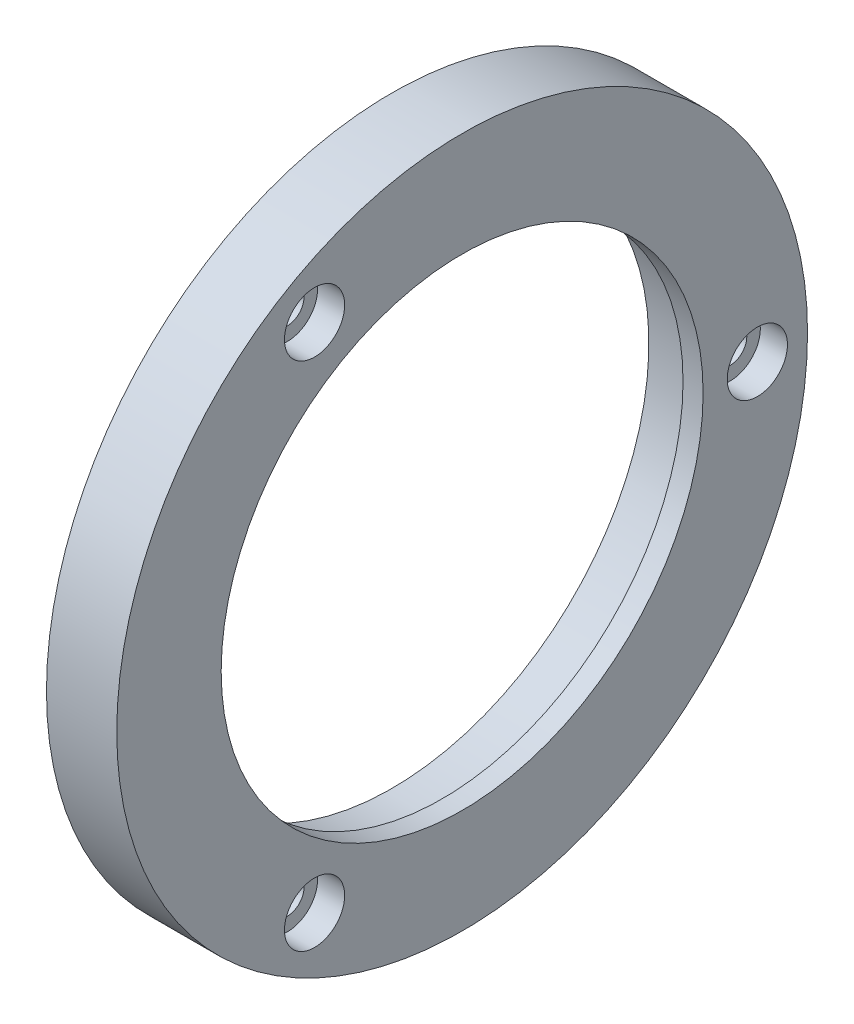
ISO-10303-21;
HEADER;
FILE_DESCRIPTION(('STEP AP214'),'2;1');
FILE_NAME('part.step','',(''),(''),'','','');
FILE_SCHEMA(('AUTOMOTIVE_DESIGN { 1 0 10303 214 1 1 1 1 }'));
ENDSEC;
DATA;
#1=APPLICATION_CONTEXT('core data for automotive mechanical design processes');
#2=APPLICATION_PROTOCOL_DEFINITION('international standard','automotive_design',2000,#1);
#3=PRODUCT_CONTEXT('',#1,'mechanical');
#4=PRODUCT('Part','Part','',(#3));
#5=PRODUCT_RELATED_PRODUCT_CATEGORY('part','',(#4));
#6=PRODUCT_DEFINITION_FORMATION('','',#4);
#7=PRODUCT_DEFINITION_CONTEXT('part definition',#1,'design');
#8=PRODUCT_DEFINITION('design','',#6,#7);
#9=PRODUCT_DEFINITION_SHAPE('','',#8);
#10=(LENGTH_UNIT() NAMED_UNIT(*) SI_UNIT(.MILLI.,.METRE.));
#11=(NAMED_UNIT(*) PLANE_ANGLE_UNIT() SI_UNIT($,.RADIAN.));
#12=(NAMED_UNIT(*) SI_UNIT($,.STERADIAN.) SOLID_ANGLE_UNIT());
#13=UNCERTAINTY_MEASURE_WITH_UNIT(LENGTH_MEASURE(1.E-05),#10,'distance_accuracy_value','');
#14=(GEOMETRIC_REPRESENTATION_CONTEXT(3) GLOBAL_UNCERTAINTY_ASSIGNED_CONTEXT((#13)) GLOBAL_UNIT_ASSIGNED_CONTEXT((#10,
#11,#12)) REPRESENTATION_CONTEXT('',''));
#15=CARTESIAN_POINT('',(0.,0.,0.));
#16=DIRECTION('',(0.,0.,1.));
#17=DIRECTION('',(1.,0.,0.));
#18=AXIS2_PLACEMENT_3D('',#15,#16,#17);
#19=CARTESIAN_POINT('',(176.7,-25.4611468712625,14.7));
#20=DIRECTION('',(-1.,0.,0.));
#21=DIRECTION('',(0.,0.,1.));
#22=AXIS2_PLACEMENT_3D('',#19,#20,#21);
#23=CYLINDRICAL_SURFACE('',#22,1.65);
#24=CARTESIAN_POINT('',(169.7,-25.4611468712625,14.7));
#25=DIRECTION('',(1.,0.,0.));
#26=DIRECTION('',(0.,0.,-1.));
#27=AXIS2_PLACEMENT_3D('',#24,#25,#26);
#28=CIRCLE('',#27,1.65);
#29=CARTESIAN_POINT('',(169.7,-25.4611468712625,13.05));
#30=VERTEX_POINT('',#29);
#31=EDGE_CURVE('E56',#30,#30,#28,.F.);
#32=ORIENTED_EDGE('',*,*,#31,.T.);
#33=EDGE_LOOP('',(#32));
#34=FACE_BOUND('',#33,.T.);
#35=CARTESIAN_POINT('',(174.,-25.4611468712625,14.7));
#36=DIRECTION('',(1.,0.,0.));
#37=DIRECTION('',(0.,0.,-1.));
#38=AXIS2_PLACEMENT_3D('',#35,#36,#37);
#39=CIRCLE('',#38,1.65);
#40=CARTESIAN_POINT('',(174.,-25.4611468712625,13.05));
#41=VERTEX_POINT('',#40);
#42=EDGE_CURVE('E35',#41,#41,#39,.T.);
#43=ORIENTED_EDGE('',*,*,#42,.T.);
#44=EDGE_LOOP('',(#43));
#45=FACE_BOUND('',#44,.T.);
#46=ADVANCED_FACE('F31',(#34,#45),#23,.F.);
#47=CARTESIAN_POINT('',(176.7,25.4611468712625,14.7));
#48=DIRECTION('',(-1.,0.,0.));
#49=DIRECTION('',(0.,0.,1.));
#50=AXIS2_PLACEMENT_3D('',#47,#48,#49);
#51=CYLINDRICAL_SURFACE('',#50,1.65);
#52=CARTESIAN_POINT('',(169.7,25.4611468712625,14.7));
#53=DIRECTION('',(1.,0.,0.));
#54=DIRECTION('',(0.,0.,-1.));
#55=AXIS2_PLACEMENT_3D('',#52,#53,#54);
#56=CIRCLE('',#55,1.65);
#57=CARTESIAN_POINT('',(169.7,25.4611468712625,13.05));
#58=VERTEX_POINT('',#57);
#59=EDGE_CURVE('E60',#58,#58,#56,.F.);
#60=ORIENTED_EDGE('',*,*,#59,.T.);
#61=EDGE_LOOP('',(#60));
#62=FACE_BOUND('',#61,.T.);
#63=CARTESIAN_POINT('',(174.,25.4611468712625,14.7));
#64=DIRECTION('',(1.,0.,0.));
#65=DIRECTION('',(0.,0.,-1.));
#66=AXIS2_PLACEMENT_3D('',#63,#64,#65);
#67=CIRCLE('',#66,1.65);
#68=CARTESIAN_POINT('',(174.,25.4611468712625,13.05));
#69=VERTEX_POINT('',#68);
#70=EDGE_CURVE('E50',#69,#69,#67,.T.);
#71=ORIENTED_EDGE('',*,*,#70,.T.);
#72=EDGE_LOOP('',(#71));
#73=FACE_BOUND('',#72,.T.);
#74=ADVANCED_FACE('F100',(#62,#73),#51,.F.);
#75=CARTESIAN_POINT('',(176.7,0.,-29.4));
#76=DIRECTION('',(-1.,0.,0.));
#77=DIRECTION('',(0.,0.,1.));
#78=AXIS2_PLACEMENT_3D('',#75,#76,#77);
#79=CYLINDRICAL_SURFACE('',#78,1.65);
#80=CARTESIAN_POINT('',(169.7,0.,-29.4));
#81=DIRECTION('',(1.,0.,0.));
#82=DIRECTION('',(0.,0.,-1.));
#83=AXIS2_PLACEMENT_3D('',#80,#81,#82);
#84=CIRCLE('',#83,1.65);
#85=CARTESIAN_POINT('',(169.7,0.,-31.05));
#86=VERTEX_POINT('',#85);
#87=EDGE_CURVE('E65',#86,#86,#84,.F.);
#88=ORIENTED_EDGE('',*,*,#87,.T.);
#89=EDGE_LOOP('',(#88));
#90=FACE_BOUND('',#89,.T.);
#91=CARTESIAN_POINT('',(174.,0.,-29.4));
#92=DIRECTION('',(1.,0.,0.));
#93=DIRECTION('',(0.,0.,-1.));
#94=AXIS2_PLACEMENT_3D('',#91,#92,#93);
#95=CIRCLE('',#94,1.65);
#96=CARTESIAN_POINT('',(174.,0.,-31.05));
#97=VERTEX_POINT('',#96);
#98=EDGE_CURVE('E48',#97,#97,#95,.T.);
#99=ORIENTED_EDGE('',*,*,#98,.T.);
#100=EDGE_LOOP('',(#99));
#101=FACE_BOUND('',#100,.T.);
#102=ADVANCED_FACE('F97',(#90,#101),#79,.F.);
#103=CARTESIAN_POINT('',(169.7,34.4,0.));
#104=DIRECTION('',(1.,0.,0.));
#105=DIRECTION('',(0.,0.,-1.));
#106=AXIS2_PLACEMENT_3D('',#103,#104,#105);
#107=PLANE('',#106);
#108=ORIENTED_EDGE('',*,*,#87,.F.);
#109=EDGE_LOOP('',(#108));
#110=FACE_BOUND('',#109,.T.);
#111=ORIENTED_EDGE('',*,*,#59,.F.);
#112=EDGE_LOOP('',(#111));
#113=FACE_BOUND('',#112,.T.);
#114=ORIENTED_EDGE('',*,*,#31,.F.);
#115=EDGE_LOOP('',(#114));
#116=FACE_BOUND('',#115,.T.);
#117=CARTESIAN_POINT('',(169.7,0.,0.));
#118=DIRECTION('',(-1.,0.,0.));
#119=DIRECTION('',(0.,0.,1.));
#120=AXIS2_PLACEMENT_3D('',#117,#118,#119);
#121=CIRCLE('',#120,25.6);
#122=CARTESIAN_POINT('',(169.7,0.,25.6));
#123=VERTEX_POINT('',#122);
#124=EDGE_CURVE('E10',#123,#123,#121,.T.);
#125=ORIENTED_EDGE('',*,*,#124,.F.);
#126=EDGE_LOOP('',(#125));
#127=FACE_BOUND('',#126,.T.);
#128=CARTESIAN_POINT('',(169.7,0.,0.));
#129=DIRECTION('',(-1.,0.,0.));
#130=DIRECTION('',(0.,0.,1.));
#131=AXIS2_PLACEMENT_3D('',#128,#129,#130);
#132=CIRCLE('',#131,34.4);
#133=CARTESIAN_POINT('',(169.7,0.,34.4));
#134=VERTEX_POINT('',#133);
#135=EDGE_CURVE('E73',#134,#134,#132,.T.);
#136=ORIENTED_EDGE('',*,*,#135,.T.);
#137=EDGE_LOOP('',(#136));
#138=FACE_BOUND('',#137,.T.);
#139=ADVANCED_FACE('F33',(#110,#113,#116,#127,#138),#107,.F.);
#140=CARTESIAN_POINT('',(-110.,0.,0.));
#141=DIRECTION('',(-1.,0.,0.));
#142=DIRECTION('',(0.,0.,1.));
#143=AXIS2_PLACEMENT_3D('',#140,#141,#142);
#144=CYLINDRICAL_SURFACE('',#143,25.6);
#145=CARTESIAN_POINT('',(174.7,0.,0.));
#146=DIRECTION('',(-1.,0.,0.));
#147=DIRECTION('',(0.,0.,1.));
#148=AXIS2_PLACEMENT_3D('',#145,#146,#147);
#149=CIRCLE('',#148,25.6);
#150=CARTESIAN_POINT('',(174.7,0.,25.6));
#151=VERTEX_POINT('',#150);
#152=EDGE_CURVE('E39',#151,#151,#149,.T.);
#153=ORIENTED_EDGE('',*,*,#152,.F.);
#154=EDGE_LOOP('',(#153));
#155=FACE_BOUND('',#154,.T.);
#156=ORIENTED_EDGE('',*,*,#124,.T.);
#157=EDGE_LOOP('',(#156));
#158=FACE_BOUND('',#157,.T.);
#159=ADVANCED_FACE('F89',(#155,#158),#144,.F.);
#160=CARTESIAN_POINT('',(174.7,25.6,0.));
#161=DIRECTION('',(1.,0.,0.));
#162=DIRECTION('',(0.,0.,-1.));
#163=AXIS2_PLACEMENT_3D('',#160,#161,#162);
#164=PLANE('',#163);
#165=CARTESIAN_POINT('',(174.7,0.,0.));
#166=DIRECTION('',(-1.,0.,0.));
#167=DIRECTION('',(0.,0.,1.));
#168=AXIS2_PLACEMENT_3D('',#165,#166,#167);
#169=CIRCLE('',#168,24.);
#170=CARTESIAN_POINT('',(174.7,0.,24.));
#171=VERTEX_POINT('',#170);
#172=EDGE_CURVE('E44',#171,#171,#169,.T.);
#173=ORIENTED_EDGE('',*,*,#172,.F.);
#174=EDGE_LOOP('',(#173));
#175=FACE_BOUND('',#174,.T.);
#176=ORIENTED_EDGE('',*,*,#152,.T.);
#177=EDGE_LOOP('',(#176));
#178=FACE_BOUND('',#177,.T.);
#179=ADVANCED_FACE('F86',(#175,#178),#164,.F.);
#180=CARTESIAN_POINT('',(-110.,0.,0.));
#181=DIRECTION('',(-1.,0.,0.));
#182=DIRECTION('',(0.,0.,1.));
#183=AXIS2_PLACEMENT_3D('',#180,#181,#182);
#184=CYLINDRICAL_SURFACE('',#183,24.);
#185=CARTESIAN_POINT('',(176.7,0.,0.));
#186=DIRECTION('',(-1.,0.,0.));
#187=DIRECTION('',(0.,0.,1.));
#188=AXIS2_PLACEMENT_3D('',#185,#186,#187);
#189=CIRCLE('',#188,24.);
#190=CARTESIAN_POINT('',(176.7,0.,24.));
#191=VERTEX_POINT('',#190);
#192=EDGE_CURVE('E79',#191,#191,#189,.T.);
#193=ORIENTED_EDGE('',*,*,#192,.F.);
#194=EDGE_LOOP('',(#193));
#195=FACE_BOUND('',#194,.T.);
#196=ORIENTED_EDGE('',*,*,#172,.T.);
#197=EDGE_LOOP('',(#196));
#198=FACE_BOUND('',#197,.T.);
#199=ADVANCED_FACE('F84',(#195,#198),#184,.F.);
#200=CARTESIAN_POINT('',(176.7,24.,0.));
#201=DIRECTION('',(-1.,0.,0.));
#202=DIRECTION('',(0.,0.,1.));
#203=AXIS2_PLACEMENT_3D('',#200,#201,#202);
#204=PLANE('',#203);
#205=CARTESIAN_POINT('',(176.7,0.,-29.4));
#206=DIRECTION('',(1.,0.,0.));
#207=DIRECTION('',(0.,0.,-1.));
#208=AXIS2_PLACEMENT_3D('',#205,#206,#207);
#209=CIRCLE('',#208,3.);
#210=CARTESIAN_POINT('',(176.7,0.,-32.4));
#211=VERTEX_POINT('',#210);
#212=EDGE_CURVE('E51',#211,#211,#209,.T.);
#213=ORIENTED_EDGE('',*,*,#212,.F.);
#214=EDGE_LOOP('',(#213));
#215=FACE_BOUND('',#214,.T.);
#216=CARTESIAN_POINT('',(176.7,25.4611468712625,14.7));
#217=DIRECTION('',(1.,0.,0.));
#218=DIRECTION('',(0.,0.,-1.));
#219=AXIS2_PLACEMENT_3D('',#216,#217,#218);
#220=CIRCLE('',#219,3.);
#221=CARTESIAN_POINT('',(176.7,25.4611468712625,11.7));
#222=VERTEX_POINT('',#221);
#223=EDGE_CURVE('E241',#222,#222,#220,.T.);
#224=ORIENTED_EDGE('',*,*,#223,.F.);
#225=EDGE_LOOP('',(#224));
#226=FACE_BOUND('',#225,.T.);
#227=CARTESIAN_POINT('',(176.7,-25.4611468712625,14.7));
#228=DIRECTION('',(1.,0.,0.));
#229=DIRECTION('',(0.,0.,-1.));
#230=AXIS2_PLACEMENT_3D('',#227,#228,#229);
#231=CIRCLE('',#230,3.);
#232=CARTESIAN_POINT('',(176.7,-25.4611468712625,11.7));
#233=VERTEX_POINT('',#232);
#234=EDGE_CURVE('E250',#233,#233,#231,.T.);
#235=ORIENTED_EDGE('',*,*,#234,.F.);
#236=EDGE_LOOP('',(#235));
#237=FACE_BOUND('',#236,.T.);
#238=CARTESIAN_POINT('',(176.7,0.,0.));
#239=DIRECTION('',(-1.,0.,0.));
#240=DIRECTION('',(0.,0.,1.));
#241=AXIS2_PLACEMENT_3D('',#238,#239,#240);
#242=CIRCLE('',#241,34.4);
#243=CARTESIAN_POINT('',(176.7,0.,34.4));
#244=VERTEX_POINT('',#243);
#245=EDGE_CURVE('E76',#244,#244,#242,.T.);
#246=ORIENTED_EDGE('',*,*,#245,.F.);
#247=EDGE_LOOP('',(#246));
#248=FACE_BOUND('',#247,.T.);
#249=ORIENTED_EDGE('',*,*,#192,.T.);
#250=EDGE_LOOP('',(#249));
#251=FACE_BOUND('',#250,.T.);
#252=ADVANCED_FACE('F113',(#215,#226,#237,#248,#251),#204,.F.);
#253=CARTESIAN_POINT('',(-110.,0.,0.));
#254=DIRECTION('',(-1.,0.,0.));
#255=DIRECTION('',(0.,0.,1.));
#256=AXIS2_PLACEMENT_3D('',#253,#254,#255);
#257=CYLINDRICAL_SURFACE('',#256,34.4);
#258=ORIENTED_EDGE('',*,*,#135,.F.);
#259=EDGE_LOOP('',(#258));
#260=FACE_BOUND('',#259,.T.);
#261=ORIENTED_EDGE('',*,*,#245,.T.);
#262=EDGE_LOOP('',(#261));
#263=FACE_BOUND('',#262,.T.);
#264=ADVANCED_FACE('F109',(#260,#263),#257,.T.);
#265=CARTESIAN_POINT('',(176.7,0.,-29.4));
#266=DIRECTION('',(-1.,0.,0.));
#267=DIRECTION('',(0.,0.,1.));
#268=AXIS2_PLACEMENT_3D('',#265,#266,#267);
#269=CYLINDRICAL_SURFACE('',#268,3.);
#270=ORIENTED_EDGE('',*,*,#212,.T.);
#271=EDGE_LOOP('',(#270));
#272=FACE_BOUND('',#271,.T.);
#273=CARTESIAN_POINT('',(174.,0.,-29.4));
#274=DIRECTION('',(1.,0.,0.));
#275=DIRECTION('',(0.,0.,-1.));
#276=AXIS2_PLACEMENT_3D('',#273,#274,#275);
#277=CIRCLE('',#276,3.);
#278=CARTESIAN_POINT('',(174.,0.,-32.4));
#279=VERTEX_POINT('',#278);
#280=EDGE_CURVE('E239',#279,#279,#277,.T.);
#281=ORIENTED_EDGE('',*,*,#280,.F.);
#282=EDGE_LOOP('',(#281));
#283=FACE_BOUND('',#282,.T.);
#284=ADVANCED_FACE('F112',(#272,#283),#269,.F.);
#285=CARTESIAN_POINT('',(174.,0.,-29.4));
#286=DIRECTION('',(1.,0.,0.));
#287=DIRECTION('',(0.,0.,-1.));
#288=AXIS2_PLACEMENT_3D('',#285,#286,#287);
#289=PLANE('',#288);
#290=ORIENTED_EDGE('',*,*,#98,.F.);
#291=EDGE_LOOP('',(#290));
#292=FACE_BOUND('',#291,.T.);
#293=ORIENTED_EDGE('',*,*,#280,.T.);
#294=EDGE_LOOP('',(#293));
#295=FACE_BOUND('',#294,.T.);
#296=ADVANCED_FACE('F142',(#292,#295),#289,.T.);
#297=CARTESIAN_POINT('',(176.7,25.4611468712625,14.7));
#298=DIRECTION('',(-1.,0.,0.));
#299=DIRECTION('',(0.,0.,1.));
#300=AXIS2_PLACEMENT_3D('',#297,#298,#299);
#301=CYLINDRICAL_SURFACE('',#300,3.);
#302=ORIENTED_EDGE('',*,*,#223,.T.);
#303=EDGE_LOOP('',(#302));
#304=FACE_BOUND('',#303,.T.);
#305=CARTESIAN_POINT('',(174.,25.4611468712625,14.7));
#306=DIRECTION('',(1.,0.,0.));
#307=DIRECTION('',(0.,0.,-1.));
#308=AXIS2_PLACEMENT_3D('',#305,#306,#307);
#309=CIRCLE('',#308,3.);
#310=CARTESIAN_POINT('',(174.,25.4611468712625,11.7));
#311=VERTEX_POINT('',#310);
#312=EDGE_CURVE('E246',#311,#311,#309,.T.);
#313=ORIENTED_EDGE('',*,*,#312,.F.);
#314=EDGE_LOOP('',(#313));
#315=FACE_BOUND('',#314,.T.);
#316=ADVANCED_FACE('F150',(#304,#315),#301,.F.);
#317=CARTESIAN_POINT('',(174.,25.4611468712625,14.7));
#318=DIRECTION('',(1.,0.,0.));
#319=DIRECTION('',(0.,0.,-1.));
#320=AXIS2_PLACEMENT_3D('',#317,#318,#319);
#321=PLANE('',#320);
#322=ORIENTED_EDGE('',*,*,#70,.F.);
#323=EDGE_LOOP('',(#322));
#324=FACE_BOUND('',#323,.T.);
#325=ORIENTED_EDGE('',*,*,#312,.T.);
#326=EDGE_LOOP('',(#325));
#327=FACE_BOUND('',#326,.T.);
#328=ADVANCED_FACE('F158',(#324,#327),#321,.T.);
#329=CARTESIAN_POINT('',(176.7,-25.4611468712625,14.7));
#330=DIRECTION('',(-1.,0.,0.));
#331=DIRECTION('',(0.,0.,1.));
#332=AXIS2_PLACEMENT_3D('',#329,#330,#331);
#333=CYLINDRICAL_SURFACE('',#332,3.);
#334=ORIENTED_EDGE('',*,*,#234,.T.);
#335=EDGE_LOOP('',(#334));
#336=FACE_BOUND('',#335,.T.);
#337=CARTESIAN_POINT('',(174.,-25.4611468712625,14.7));
#338=DIRECTION('',(1.,0.,0.));
#339=DIRECTION('',(0.,0.,-1.));
#340=AXIS2_PLACEMENT_3D('',#337,#338,#339);
#341=CIRCLE('',#340,3.);
#342=CARTESIAN_POINT('',(174.,-25.4611468712625,11.7));
#343=VERTEX_POINT('',#342);
#344=EDGE_CURVE('E68',#343,#343,#341,.T.);
#345=ORIENTED_EDGE('',*,*,#344,.F.);
#346=EDGE_LOOP('',(#345));
#347=FACE_BOUND('',#346,.T.);
#348=ADVANCED_FACE('F166',(#336,#347),#333,.F.);
#349=CARTESIAN_POINT('',(174.,-25.4611468712625,14.7));
#350=DIRECTION('',(1.,0.,0.));
#351=DIRECTION('',(0.,0.,-1.));
#352=AXIS2_PLACEMENT_3D('',#349,#350,#351);
#353=PLANE('',#352);
#354=ORIENTED_EDGE('',*,*,#42,.F.);
#355=EDGE_LOOP('',(#354));
#356=FACE_BOUND('',#355,.T.);
#357=ORIENTED_EDGE('',*,*,#344,.T.);
#358=EDGE_LOOP('',(#357));
#359=FACE_BOUND('',#358,.T.);
#360=ADVANCED_FACE('F174',(#356,#359),#353,.T.);
#361=CLOSED_SHELL('',(#46,#74,#102,#139,#159,#179,#199,#252,#264,#284,#296,#316,#328,#348,#360));
#362=MANIFOLD_SOLID_BREP('B2',#361);
#363=ADVANCED_BREP_SHAPE_REPRESENTATION('',(#18,#362),#14);
#364=SHAPE_DEFINITION_REPRESENTATION(#9,#363);
ENDSEC;
END-ISO-10303-21;
